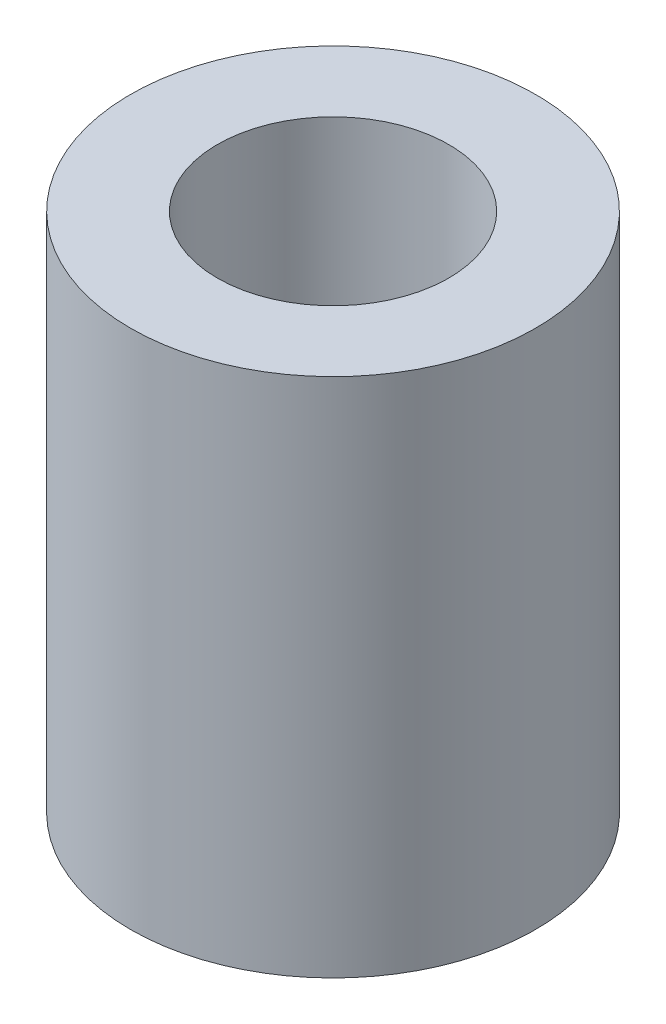
ISO-10303-21;
HEADER;
FILE_DESCRIPTION(('STEP AP214'),'2;1');
FILE_NAME('part.step','',(''),(''),'','','');
FILE_SCHEMA(('AUTOMOTIVE_DESIGN { 1 0 10303 214 1 1 1 1 }'));
ENDSEC;
DATA;
#1=APPLICATION_CONTEXT('core data for automotive mechanical design processes');
#2=APPLICATION_PROTOCOL_DEFINITION('international standard','automotive_design',2000,#1);
#3=PRODUCT_CONTEXT('',#1,'mechanical');
#4=PRODUCT('Part','Part','',(#3));
#5=PRODUCT_RELATED_PRODUCT_CATEGORY('part','',(#4));
#6=PRODUCT_DEFINITION_FORMATION('','',#4);
#7=PRODUCT_DEFINITION_CONTEXT('part definition',#1,'design');
#8=PRODUCT_DEFINITION('design','',#6,#7);
#9=PRODUCT_DEFINITION_SHAPE('','',#8);
#10=(LENGTH_UNIT() NAMED_UNIT(*) SI_UNIT(.MILLI.,.METRE.));
#11=(NAMED_UNIT(*) PLANE_ANGLE_UNIT() SI_UNIT($,.RADIAN.));
#12=(NAMED_UNIT(*) SI_UNIT($,.STERADIAN.) SOLID_ANGLE_UNIT());
#13=UNCERTAINTY_MEASURE_WITH_UNIT(LENGTH_MEASURE(1.E-05),#10,'distance_accuracy_value','');
#14=(GEOMETRIC_REPRESENTATION_CONTEXT(3) GLOBAL_UNCERTAINTY_ASSIGNED_CONTEXT((#13)) GLOBAL_UNIT_ASSIGNED_CONTEXT((#10,
#11,#12)) REPRESENTATION_CONTEXT('',''));
#15=CARTESIAN_POINT('',(0.,0.,0.));
#16=DIRECTION('',(0.,0.,1.));
#17=DIRECTION('',(1.,0.,0.));
#18=AXIS2_PLACEMENT_3D('',#15,#16,#17);
#19=CARTESIAN_POINT('',(0.,9.,0.));
#20=DIRECTION('',(0.,1.,0.));
#21=DIRECTION('',(0.,0.,1.));
#22=AXIS2_PLACEMENT_3D('',#19,#20,#21);
#23=PLANE('',#22);
#24=CARTESIAN_POINT('',(0.,9.,0.));
#25=DIRECTION('',(0.,1.,0.));
#26=DIRECTION('',(0.,0.,1.));
#27=AXIS2_PLACEMENT_3D('',#24,#25,#26);
#28=CIRCLE('',#27,3.5);
#29=CARTESIAN_POINT('',(0.,9.,3.5));
#30=VERTEX_POINT('',#29);
#31=EDGE_CURVE('E10',#30,#30,#28,.T.);
#32=ORIENTED_EDGE('',*,*,#31,.T.);
#33=EDGE_LOOP('',(#32));
#34=FACE_BOUND('',#33,.T.);
#35=CARTESIAN_POINT('',(0.,9.,0.));
#36=DIRECTION('',(0.,1.,0.));
#37=DIRECTION('',(0.,0.,1.));
#38=AXIS2_PLACEMENT_3D('',#35,#36,#37);
#39=CIRCLE('',#38,2.);
#40=CARTESIAN_POINT('',(0.,9.,2.));
#41=VERTEX_POINT('',#40);
#42=EDGE_CURVE('E50',#41,#41,#39,.T.);
#43=ORIENTED_EDGE('',*,*,#42,.F.);
#44=EDGE_LOOP('',(#43));
#45=FACE_BOUND('',#44,.T.);
#46=ADVANCED_FACE('F37',(#34,#45),#23,.T.);
#47=CARTESIAN_POINT('',(0.,0.,0.));
#48=DIRECTION('',(0.,1.,0.));
#49=DIRECTION('',(0.,0.,1.));
#50=AXIS2_PLACEMENT_3D('',#47,#48,#49);
#51=PLANE('',#50);
#52=CARTESIAN_POINT('',(0.,0.,0.));
#53=DIRECTION('',(0.,1.,0.));
#54=DIRECTION('',(0.,0.,1.));
#55=AXIS2_PLACEMENT_3D('',#52,#53,#54);
#56=CIRCLE('',#55,3.5);
#57=CARTESIAN_POINT('',(0.,0.,3.5));
#58=VERTEX_POINT('',#57);
#59=EDGE_CURVE('E41',#58,#58,#56,.T.);
#60=ORIENTED_EDGE('',*,*,#59,.F.);
#61=EDGE_LOOP('',(#60));
#62=FACE_BOUND('',#61,.T.);
#63=CARTESIAN_POINT('',(0.,0.,0.));
#64=DIRECTION('',(0.,1.,0.));
#65=DIRECTION('',(0.,0.,1.));
#66=AXIS2_PLACEMENT_3D('',#63,#64,#65);
#67=CIRCLE('',#66,2.);
#68=CARTESIAN_POINT('',(0.,0.,2.));
#69=VERTEX_POINT('',#68);
#70=EDGE_CURVE('E52',#69,#69,#67,.T.);
#71=ORIENTED_EDGE('',*,*,#70,.T.);
#72=EDGE_LOOP('',(#71));
#73=FACE_BOUND('',#72,.T.);
#74=ADVANCED_FACE('F64',(#62,#73),#51,.F.);
#75=CARTESIAN_POINT('',(0.,9.,0.));
#76=DIRECTION('',(0.,-1.,0.));
#77=DIRECTION('',(0.,0.,-1.));
#78=AXIS2_PLACEMENT_3D('',#75,#76,#77);
#79=CYLINDRICAL_SURFACE('',#78,3.5);
#80=ORIENTED_EDGE('',*,*,#31,.F.);
#81=EDGE_LOOP('',(#80));
#82=FACE_BOUND('',#81,.T.);
#83=ORIENTED_EDGE('',*,*,#59,.T.);
#84=EDGE_LOOP('',(#83));
#85=FACE_BOUND('',#84,.T.);
#86=ADVANCED_FACE('F39',(#82,#85),#79,.T.);
#87=CARTESIAN_POINT('',(0.,9.,0.));
#88=DIRECTION('',(0.,-1.,0.));
#89=DIRECTION('',(0.,0.,-1.));
#90=AXIS2_PLACEMENT_3D('',#87,#88,#89);
#91=CYLINDRICAL_SURFACE('',#90,2.);
#92=ORIENTED_EDGE('',*,*,#42,.T.);
#93=EDGE_LOOP('',(#92));
#94=FACE_BOUND('',#93,.T.);
#95=ORIENTED_EDGE('',*,*,#70,.F.);
#96=EDGE_LOOP('',(#95));
#97=FACE_BOUND('',#96,.T.);
#98=ADVANCED_FACE('F60',(#94,#97),#91,.F.);
#99=CLOSED_SHELL('',(#46,#74,#86,#98));
#100=MANIFOLD_SOLID_BREP('B2',#99);
#101=ADVANCED_BREP_SHAPE_REPRESENTATION('',(#18,#100),#14);
#102=SHAPE_DEFINITION_REPRESENTATION(#9,#101);
ENDSEC;
END-ISO-10303-21;
